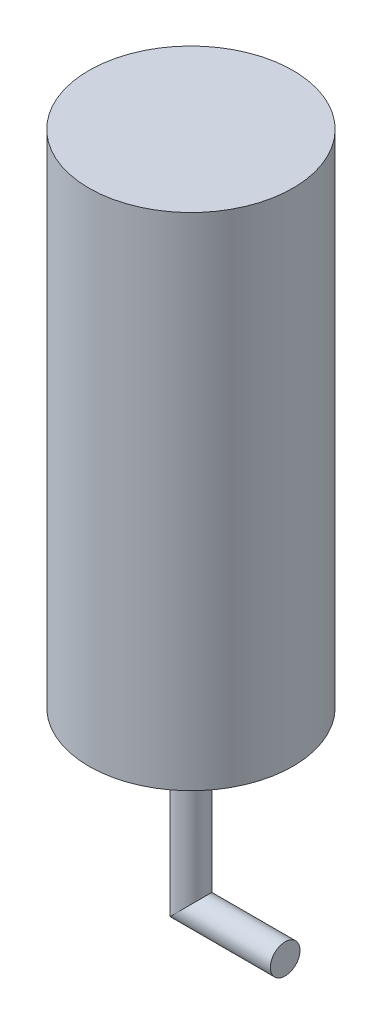
ISO-10303-21;
HEADER;
FILE_DESCRIPTION(('STEP AP214'),'2;1');
FILE_NAME('part.step','',(''),(''),'','','');
FILE_SCHEMA(('AUTOMOTIVE_DESIGN { 1 0 10303 214 1 1 1 1 }'));
ENDSEC;
DATA;
#1=APPLICATION_CONTEXT('core data for automotive mechanical design processes');
#2=APPLICATION_PROTOCOL_DEFINITION('international standard','automotive_design',2000,#1);
#3=PRODUCT_CONTEXT('',#1,'mechanical');
#4=PRODUCT('Part','Part','',(#3));
#5=PRODUCT_RELATED_PRODUCT_CATEGORY('part','',(#4));
#6=PRODUCT_DEFINITION_FORMATION('','',#4);
#7=PRODUCT_DEFINITION_CONTEXT('part definition',#1,'design');
#8=PRODUCT_DEFINITION('design','',#6,#7);
#9=PRODUCT_DEFINITION_SHAPE('','',#8);
#10=(LENGTH_UNIT() NAMED_UNIT(*) SI_UNIT(.MILLI.,.METRE.));
#11=(NAMED_UNIT(*) PLANE_ANGLE_UNIT() SI_UNIT($,.RADIAN.));
#12=(NAMED_UNIT(*) SI_UNIT($,.STERADIAN.) SOLID_ANGLE_UNIT());
#13=UNCERTAINTY_MEASURE_WITH_UNIT(LENGTH_MEASURE(1.E-05),#10,'distance_accuracy_value','');
#14=(GEOMETRIC_REPRESENTATION_CONTEXT(3) GLOBAL_UNCERTAINTY_ASSIGNED_CONTEXT((#13)) GLOBAL_UNIT_ASSIGNED_CONTEXT((#10,
#11,#12)) REPRESENTATION_CONTEXT('',''));
#15=CARTESIAN_POINT('',(0.,0.,0.));
#16=DIRECTION('',(0.,0.,1.));
#17=DIRECTION('',(1.,0.,0.));
#18=AXIS2_PLACEMENT_3D('',#15,#16,#17);
#19=CARTESIAN_POINT('',(0.,13.5,0.));
#20=DIRECTION('',(0.,-1.,0.));
#21=DIRECTION('',(0.,0.,-1.));
#22=AXIS2_PLACEMENT_3D('',#19,#20,#21);
#23=CYLINDRICAL_SURFACE('',#22,2.75);
#24=CARTESIAN_POINT('',(0.,13.5,0.));
#25=DIRECTION('',(0.,1.,0.));
#26=DIRECTION('',(0.,0.,1.));
#27=AXIS2_PLACEMENT_3D('',#24,#25,#26);
#28=CIRCLE('',#27,2.75);
#29=CARTESIAN_POINT('',(0.,13.5,2.75));
#30=VERTEX_POINT('',#29);
#31=EDGE_CURVE('E49',#30,#30,#28,.T.);
#32=ORIENTED_EDGE('',*,*,#31,.F.);
#33=EDGE_LOOP('',(#32));
#34=FACE_BOUND('',#33,.T.);
#35=CARTESIAN_POINT('',(0.,0.,0.));
#36=DIRECTION('',(0.,1.,0.));
#37=DIRECTION('',(0.,0.,1.));
#38=AXIS2_PLACEMENT_3D('',#35,#36,#37);
#39=CIRCLE('',#38,2.75);
#40=CARTESIAN_POINT('',(0.,0.,2.75));
#41=VERTEX_POINT('',#40);
#42=EDGE_CURVE('E44',#41,#41,#39,.T.);
#43=ORIENTED_EDGE('',*,*,#42,.T.);
#44=EDGE_LOOP('',(#43));
#45=FACE_BOUND('',#44,.T.);
#46=ADVANCED_FACE('F41',(#34,#45),#23,.T.);
#47=CARTESIAN_POINT('',(0.,13.5,0.));
#48=DIRECTION('',(0.,1.,0.));
#49=DIRECTION('',(0.,0.,1.));
#50=AXIS2_PLACEMENT_3D('',#47,#48,#49);
#51=PLANE('',#50);
#52=ORIENTED_EDGE('',*,*,#31,.T.);
#53=EDGE_LOOP('',(#52));
#54=FACE_BOUND('',#53,.T.);
#55=ADVANCED_FACE('F81',(#54),#51,.T.);
#56=CARTESIAN_POINT('',(0.,0.,0.));
#57=DIRECTION('',(0.,1.,0.));
#58=DIRECTION('',(0.,0.,1.));
#59=AXIS2_PLACEMENT_3D('',#56,#57,#58);
#60=PLANE('',#59);
#61=CARTESIAN_POINT('',(0.,0.,0.));
#62=DIRECTION('',(0.,-1.,0.));
#63=DIRECTION('',(0.,0.,-1.));
#64=AXIS2_PLACEMENT_3D('',#61,#62,#63);
#65=CIRCLE('',#64,0.4);
#66=CARTESIAN_POINT('',(0.,0.,-0.4));
#67=VERTEX_POINT('',#66);
#68=EDGE_CURVE('E10',#67,#67,#65,.T.);
#69=ORIENTED_EDGE('',*,*,#68,.F.);
#70=EDGE_LOOP('',(#69));
#71=FACE_BOUND('',#70,.T.);
#72=ORIENTED_EDGE('',*,*,#42,.F.);
#73=EDGE_LOOP('',(#72));
#74=FACE_BOUND('',#73,.T.);
#75=ADVANCED_FACE('F77',(#71,#74),#60,.F.);
#76=CARTESIAN_POINT('',(2.54000000000003,-4.59999999999999,0.));
#77=DIRECTION('',(1.,0.,0.));
#78=DIRECTION('',(0.,0.,-1.));
#79=AXIS2_PLACEMENT_3D('',#76,#77,#78);
#80=PLANE('',#79);
#81=CARTESIAN_POINT('',(2.54000000000003,-4.59999999999999,0.));
#82=DIRECTION('',(1.,0.,0.));
#83=DIRECTION('',(0.,0.,-1.));
#84=AXIS2_PLACEMENT_3D('',#81,#82,#83);
#85=CIRCLE('',#84,0.4);
#86=CARTESIAN_POINT('',(2.54000000000003,-4.59999999999999,-0.399999999999999));
#87=VERTEX_POINT('',#86);
#88=EDGE_CURVE('E60',#87,#87,#85,.T.);
#89=ORIENTED_EDGE('',*,*,#88,.T.);
#90=EDGE_LOOP('',(#89));
#91=FACE_BOUND('',#90,.T.);
#92=ADVANCED_FACE('F65',(#91),#80,.T.);
#93=CARTESIAN_POINT('',(-0.980000000000014,-4.60000000000001,0.));
#94=DIRECTION('',(1.,0.,0.));
#95=DIRECTION('',(0.,1.,0.));
#96=AXIS2_PLACEMENT_3D('',#93,#94,#95);
#97=CYLINDRICAL_SURFACE('',#96,0.4);
#98=CARTESIAN_POINT('',(0.,-4.60000000000001,0.));
#99=DIRECTION('',(0.70710678118655,-0.707106781186545,0.));
#100=DIRECTION('',(-0.707106781186545,-0.70710678118655,0.));
#101=AXIS2_PLACEMENT_3D('',#98,#99,#100);
#102=ELLIPSE('',#101,0.56568542494924,0.4);
#103=CARTESIAN_POINT('',(-0.4,-5.00000000000001,0.));
#104=VERTEX_POINT('',#103);
#105=EDGE_CURVE('E56',#104,#104,#102,.F.);
#106=ORIENTED_EDGE('',*,*,#105,.F.);
#107=EDGE_LOOP('',(#106));
#108=FACE_BOUND('',#107,.T.);
#109=ORIENTED_EDGE('',*,*,#88,.F.);
#110=EDGE_LOOP('',(#109));
#111=FACE_BOUND('',#110,.T.);
#112=ADVANCED_FACE('F67',(#108,#111),#97,.T.);
#113=CARTESIAN_POINT('',(0.,0.,0.));
#114=DIRECTION('',(0.,-1.,0.));
#115=DIRECTION('',(0.,0.,-1.));
#116=AXIS2_PLACEMENT_3D('',#113,#114,#115);
#117=CYLINDRICAL_SURFACE('',#116,0.4);
#118=ORIENTED_EDGE('',*,*,#68,.T.);
#119=EDGE_LOOP('',(#118));
#120=FACE_BOUND('',#119,.T.);
#121=ORIENTED_EDGE('',*,*,#105,.T.);
#122=EDGE_LOOP('',(#121));
#123=FACE_BOUND('',#122,.T.);
#124=ADVANCED_FACE('F69',(#120,#123),#117,.T.);
#125=CLOSED_SHELL('',(#46,#55,#75,#92,#112,#124));
#126=MANIFOLD_SOLID_BREP('B2',#125);
#127=ADVANCED_BREP_SHAPE_REPRESENTATION('',(#18,#126),#14);
#128=SHAPE_DEFINITION_REPRESENTATION(#9,#127);
ENDSEC;
END-ISO-10303-21;
